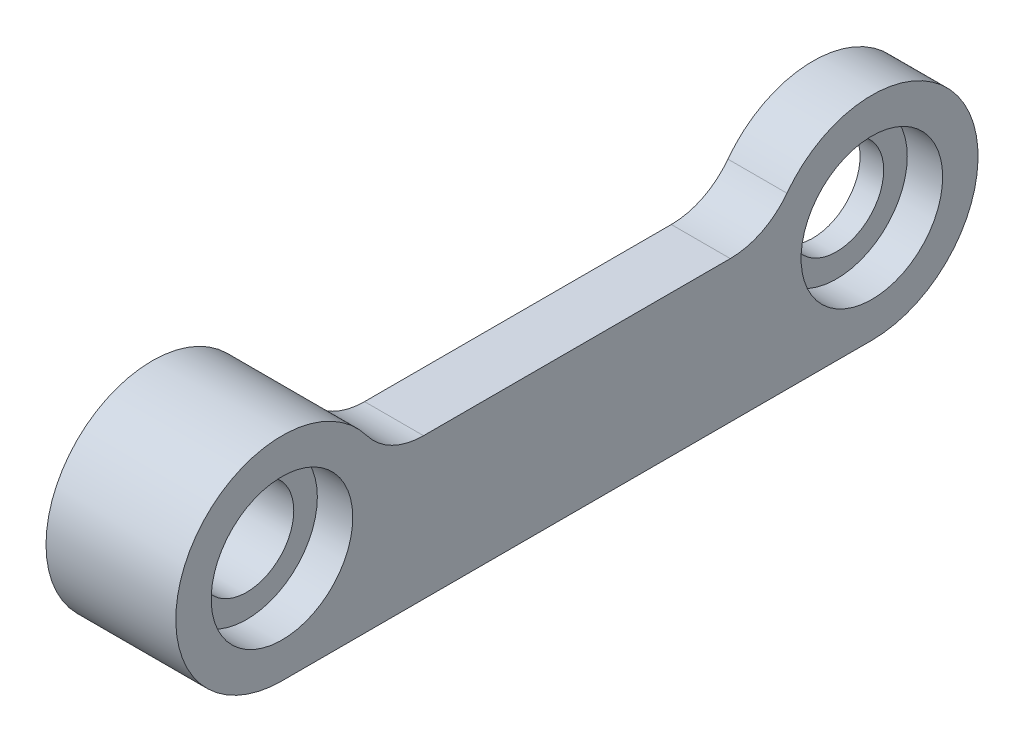
ISO-10303-21;
HEADER;
FILE_DESCRIPTION(('STEP AP214'),'2;1');
FILE_NAME('part.step','',(''),(''),'','','');
FILE_SCHEMA(('AUTOMOTIVE_DESIGN { 1 0 10303 214 1 1 1 1 }'));
ENDSEC;
DATA;
#1=APPLICATION_CONTEXT('core data for automotive mechanical design processes');
#2=APPLICATION_PROTOCOL_DEFINITION('international standard','automotive_design',2000,#1);
#3=PRODUCT_CONTEXT('',#1,'mechanical');
#4=PRODUCT('Part','Part','',(#3));
#5=PRODUCT_RELATED_PRODUCT_CATEGORY('part','',(#4));
#6=PRODUCT_DEFINITION_FORMATION('','',#4);
#7=PRODUCT_DEFINITION_CONTEXT('part definition',#1,'design');
#8=PRODUCT_DEFINITION('design','',#6,#7);
#9=PRODUCT_DEFINITION_SHAPE('','',#8);
#10=(LENGTH_UNIT() NAMED_UNIT(*) SI_UNIT(.MILLI.,.METRE.));
#11=(NAMED_UNIT(*) PLANE_ANGLE_UNIT() SI_UNIT($,.RADIAN.));
#12=(NAMED_UNIT(*) SI_UNIT($,.STERADIAN.) SOLID_ANGLE_UNIT());
#13=UNCERTAINTY_MEASURE_WITH_UNIT(LENGTH_MEASURE(1.E-05),#10,'distance_accuracy_value','');
#14=(GEOMETRIC_REPRESENTATION_CONTEXT(3) GLOBAL_UNCERTAINTY_ASSIGNED_CONTEXT((#13)) GLOBAL_UNIT_ASSIGNED_CONTEXT((#10,
#11,#12)) REPRESENTATION_CONTEXT('',''));
#15=CARTESIAN_POINT('',(0.,0.,0.));
#16=DIRECTION('',(0.,0.,1.));
#17=DIRECTION('',(1.,0.,0.));
#18=AXIS2_PLACEMENT_3D('',#15,#16,#17);
#19=CARTESIAN_POINT('',(2.5,-1.5,0.));
#20=DIRECTION('',(-1.,0.,0.));
#21=DIRECTION('',(0.,0.,1.));
#22=AXIS2_PLACEMENT_3D('',#19,#20,#21);
#23=CYLINDRICAL_SURFACE('',#22,2.);
#24=CARTESIAN_POINT('',(-3.,-1.5,0.));
#25=DIRECTION('',(1.,0.,0.));
#26=DIRECTION('',(0.,0.,-1.));
#27=AXIS2_PLACEMENT_3D('',#24,#25,#26);
#28=CIRCLE('',#27,2.);
#29=CARTESIAN_POINT('',(-3.,-1.5,-2.));
#30=VERTEX_POINT('',#29);
#31=EDGE_CURVE('E171',#30,#30,#28,.T.);
#32=ORIENTED_EDGE('',*,*,#31,.F.);
#33=EDGE_LOOP('',(#32));
#34=FACE_BOUND('',#33,.T.);
#35=CARTESIAN_POINT('',(1.,-1.5,0.));
#36=DIRECTION('',(1.,0.,0.));
#37=DIRECTION('',(0.,0.,-1.));
#38=AXIS2_PLACEMENT_3D('',#35,#36,#37);
#39=CIRCLE('',#38,2.);
#40=CARTESIAN_POINT('',(1.,-1.5,-2.));
#41=VERTEX_POINT('',#40);
#42=EDGE_CURVE('E73',#41,#41,#39,.T.);
#43=ORIENTED_EDGE('',*,*,#42,.T.);
#44=EDGE_LOOP('',(#43));
#45=FACE_BOUND('',#44,.T.);
#46=ADVANCED_FACE('F69',(#34,#45),#23,.F.);
#47=CARTESIAN_POINT('',(2.5,-1.5,-25.));
#48=DIRECTION('',(-1.,0.,0.));
#49=DIRECTION('',(0.,0.,1.));
#50=AXIS2_PLACEMENT_3D('',#47,#48,#49);
#51=CYLINDRICAL_SURFACE('',#50,2.);
#52=CARTESIAN_POINT('',(0.,-1.5,-25.));
#53=DIRECTION('',(1.,0.,0.));
#54=DIRECTION('',(0.,0.,-1.));
#55=AXIS2_PLACEMENT_3D('',#52,#53,#54);
#56=CIRCLE('',#55,2.);
#57=CARTESIAN_POINT('',(0.,-1.5,-27.));
#58=VERTEX_POINT('',#57);
#59=EDGE_CURVE('E167',#58,#58,#56,.F.);
#60=ORIENTED_EDGE('',*,*,#59,.T.);
#61=EDGE_LOOP('',(#60));
#62=FACE_BOUND('',#61,.T.);
#63=CARTESIAN_POINT('',(1.,-1.5,-25.));
#64=DIRECTION('',(1.,0.,0.));
#65=DIRECTION('',(0.,0.,-1.));
#66=AXIS2_PLACEMENT_3D('',#63,#64,#65);
#67=CIRCLE('',#66,2.);
#68=CARTESIAN_POINT('',(1.,-1.5,-27.));
#69=VERTEX_POINT('',#68);
#70=EDGE_CURVE('E190',#69,#69,#67,.T.);
#71=ORIENTED_EDGE('',*,*,#70,.T.);
#72=EDGE_LOOP('',(#71));
#73=FACE_BOUND('',#72,.T.);
#74=ADVANCED_FACE('F240',(#62,#73),#51,.F.);
#75=CARTESIAN_POINT('',(2.5,-1.5,0.));
#76=DIRECTION('',(1.,0.,0.));
#77=DIRECTION('',(0.,0.,-1.));
#78=AXIS2_PLACEMENT_3D('',#75,#76,#77);
#79=PLANE('',#78);
#80=CARTESIAN_POINT('',(2.5,-1.5,0.));
#81=DIRECTION('',(1.,0.,0.));
#82=DIRECTION('',(0.,0.,-1.));
#83=AXIS2_PLACEMENT_3D('',#80,#81,#82);
#84=CIRCLE('',#83,3.);
#85=CARTESIAN_POINT('',(2.5,-1.5,-3.));
#86=VERTEX_POINT('',#85);
#87=EDGE_CURVE('E200',#86,#86,#84,.T.);
#88=ORIENTED_EDGE('',*,*,#87,.F.);
#89=EDGE_LOOP('',(#88));
#90=FACE_BOUND('',#89,.T.);
#91=CARTESIAN_POINT('',(2.5,-1.5,-25.));
#92=DIRECTION('',(1.,0.,0.));
#93=DIRECTION('',(0.,0.,-1.));
#94=AXIS2_PLACEMENT_3D('',#91,#92,#93);
#95=CIRCLE('',#94,3.);
#96=CARTESIAN_POINT('',(2.5,-1.5,-28.));
#97=VERTEX_POINT('',#96);
#98=EDGE_CURVE('E212',#97,#97,#95,.T.);
#99=ORIENTED_EDGE('',*,*,#98,.F.);
#100=EDGE_LOOP('',(#99));
#101=FACE_BOUND('',#100,.T.);
#102=DIRECTION('',(0.,0.,-1.));
#103=VECTOR('',#102,1.);
#104=CARTESIAN_POINT('',(2.5,-6.,0.));
#105=LINE('',#104,#103);
#106=CARTESIAN_POINT('',(2.5,-6.,0.));
#107=VERTEX_POINT('',#106);
#108=CARTESIAN_POINT('',(2.5,-6.,-25.));
#109=VERTEX_POINT('',#108);
#110=EDGE_CURVE('E139',#107,#109,#105,.T.);
#111=ORIENTED_EDGE('',*,*,#110,.T.);
#112=CARTESIAN_POINT('',(2.5,-1.5,-25.));
#113=DIRECTION('',(1.,0.,0.));
#114=DIRECTION('',(0.,0.,-1.));
#115=AXIS2_PLACEMENT_3D('',#112,#113,#114);
#116=CIRCLE('',#115,4.5);
#117=CARTESIAN_POINT('',(2.5,1.2,-21.4));
#118=VERTEX_POINT('',#117);
#119=EDGE_CURVE('E149',#109,#118,#116,.T.);
#120=ORIENTED_EDGE('',*,*,#119,.T.);
#121=CARTESIAN_POINT('',(2.5,3.,-19.));
#122=DIRECTION('',(1.,0.,0.));
#123=DIRECTION('',(0.,0.,-1.));
#124=AXIS2_PLACEMENT_3D('',#121,#122,#123);
#125=CIRCLE('',#124,3.);
#126=CARTESIAN_POINT('',(2.5,0.,-19.));
#127=VERTEX_POINT('',#126);
#128=EDGE_CURVE('E186',#118,#127,#125,.F.);
#129=ORIENTED_EDGE('',*,*,#128,.T.);
#130=DIRECTION('',(0.,0.,-1.));
#131=VECTOR('',#130,1.);
#132=CARTESIAN_POINT('',(2.5,0.,0.));
#133=LINE('',#132,#131);
#134=CARTESIAN_POINT('',(2.5,0.,-6.));
#135=VERTEX_POINT('',#134);
#136=EDGE_CURVE('E158',#135,#127,#133,.T.);
#137=ORIENTED_EDGE('',*,*,#136,.F.);
#138=CARTESIAN_POINT('',(2.5,3.,-6.));
#139=DIRECTION('',(1.,0.,0.));
#140=DIRECTION('',(0.,0.,-1.));
#141=AXIS2_PLACEMENT_3D('',#138,#139,#140);
#142=CIRCLE('',#141,3.);
#143=CARTESIAN_POINT('',(2.5,1.2,-3.6));
#144=VERTEX_POINT('',#143);
#145=EDGE_CURVE('E12',#135,#144,#142,.F.);
#146=ORIENTED_EDGE('',*,*,#145,.T.);
#147=CARTESIAN_POINT('',(2.5,-1.5,0.));
#148=DIRECTION('',(1.,0.,0.));
#149=DIRECTION('',(0.,0.,-1.));
#150=AXIS2_PLACEMENT_3D('',#147,#148,#149);
#151=CIRCLE('',#150,4.5);
#152=EDGE_CURVE('E141',#144,#107,#151,.T.);
#153=ORIENTED_EDGE('',*,*,#152,.T.);
#154=EDGE_LOOP('',(#111,#120,#129,#137,#146,#153));
#155=FACE_BOUND('',#154,.T.);
#156=ADVANCED_FACE('F238',(#90,#101,#155),#79,.T.);
#157=CARTESIAN_POINT('',(2.5,-1.5,0.));
#158=DIRECTION('',(-1.,0.,0.));
#159=DIRECTION('',(0.,0.,1.));
#160=AXIS2_PLACEMENT_3D('',#157,#158,#159);
#161=CYLINDRICAL_SURFACE('',#160,4.5);
#162=ORIENTED_EDGE('',*,*,#152,.F.);
#163=DIRECTION('',(-1.,0.,0.));
#164=VECTOR('',#163,1.);
#165=CARTESIAN_POINT('',(2.5,1.2,-3.6));
#166=LINE('',#165,#164);
#167=CARTESIAN_POINT('',(0.,1.2,-3.6));
#168=VERTEX_POINT('',#167);
#169=EDGE_CURVE('E130',#144,#168,#166,.T.);
#170=ORIENTED_EDGE('',*,*,#169,.T.);
#171=CARTESIAN_POINT('',(0.,-1.5,0.));
#172=DIRECTION('',(1.,0.,0.));
#173=DIRECTION('',(0.,0.,-1.));
#174=AXIS2_PLACEMENT_3D('',#171,#172,#173);
#175=CIRCLE('',#174,4.5);
#176=CARTESIAN_POINT('',(0.,-6.,0.));
#177=VERTEX_POINT('',#176);
#178=EDGE_CURVE('E87',#177,#168,#175,.T.);
#179=ORIENTED_EDGE('',*,*,#178,.F.);
#180=DIRECTION('',(-1.,0.,0.));
#181=VECTOR('',#180,1.);
#182=CARTESIAN_POINT('',(2.5,-6.,0.));
#183=LINE('',#182,#181);
#184=EDGE_CURVE('E127',#107,#177,#183,.T.);
#185=ORIENTED_EDGE('',*,*,#184,.F.);
#186=EDGE_LOOP('',(#162,#170,#179,#185));
#187=FACE_BOUND('',#186,.T.);
#188=CARTESIAN_POINT('',(-3.,-1.5,0.));
#189=DIRECTION('',(1.,0.,0.));
#190=DIRECTION('',(0.,0.,-1.));
#191=AXIS2_PLACEMENT_3D('',#188,#189,#190);
#192=CIRCLE('',#191,4.5);
#193=CARTESIAN_POINT('',(-3.,-1.5,-4.5));
#194=VERTEX_POINT('',#193);
#195=EDGE_CURVE('E166',#194,#194,#192,.T.);
#196=ORIENTED_EDGE('',*,*,#195,.T.);
#197=EDGE_LOOP('',(#196));
#198=FACE_BOUND('',#197,.T.);
#199=ADVANCED_FACE('F125',(#187,#198),#161,.T.);
#200=CARTESIAN_POINT('',(0.,-1.5,0.));
#201=DIRECTION('',(1.,0.,0.));
#202=DIRECTION('',(0.,0.,-1.));
#203=AXIS2_PLACEMENT_3D('',#200,#201,#202);
#204=PLANE('',#203);
#205=ORIENTED_EDGE('',*,*,#59,.F.);
#206=EDGE_LOOP('',(#205));
#207=FACE_BOUND('',#206,.T.);
#208=DIRECTION('',(0.,0.,-1.));
#209=VECTOR('',#208,1.);
#210=CARTESIAN_POINT('',(0.,-6.,0.));
#211=LINE('',#210,#209);
#212=CARTESIAN_POINT('',(0.,-6.,-25.));
#213=VERTEX_POINT('',#212);
#214=EDGE_CURVE('E137',#177,#213,#211,.T.);
#215=ORIENTED_EDGE('',*,*,#214,.F.);
#216=ORIENTED_EDGE('',*,*,#178,.T.);
#217=CARTESIAN_POINT('',(0.,3.,-6.));
#218=DIRECTION('',(1.,0.,0.));
#219=DIRECTION('',(0.,0.,-1.));
#220=AXIS2_PLACEMENT_3D('',#217,#218,#219);
#221=CIRCLE('',#220,3.);
#222=CARTESIAN_POINT('',(0.,0.,-6.));
#223=VERTEX_POINT('',#222);
#224=EDGE_CURVE('E79',#168,#223,#221,.T.);
#225=ORIENTED_EDGE('',*,*,#224,.T.);
#226=DIRECTION('',(0.,0.,-1.));
#227=VECTOR('',#226,1.);
#228=CARTESIAN_POINT('',(0.,0.,0.));
#229=LINE('',#228,#227);
#230=CARTESIAN_POINT('',(0.,0.,-19.));
#231=VERTEX_POINT('',#230);
#232=EDGE_CURVE('E148',#223,#231,#229,.T.);
#233=ORIENTED_EDGE('',*,*,#232,.T.);
#234=CARTESIAN_POINT('',(0.,3.,-19.));
#235=DIRECTION('',(1.,0.,0.));
#236=DIRECTION('',(0.,0.,-1.));
#237=AXIS2_PLACEMENT_3D('',#234,#235,#236);
#238=CIRCLE('',#237,3.);
#239=CARTESIAN_POINT('',(0.,1.2,-21.4));
#240=VERTEX_POINT('',#239);
#241=EDGE_CURVE('E183',#231,#240,#238,.T.);
#242=ORIENTED_EDGE('',*,*,#241,.T.);
#243=CARTESIAN_POINT('',(0.,-1.5,-25.));
#244=DIRECTION('',(1.,0.,0.));
#245=DIRECTION('',(0.,0.,-1.));
#246=AXIS2_PLACEMENT_3D('',#243,#244,#245);
#247=CIRCLE('',#246,4.5);
#248=EDGE_CURVE('E146',#213,#240,#247,.T.);
#249=ORIENTED_EDGE('',*,*,#248,.F.);
#250=EDGE_LOOP('',(#215,#216,#225,#233,#242,#249));
#251=FACE_BOUND('',#250,.T.);
#252=ADVANCED_FACE('F144',(#207,#251),#204,.F.);
#253=CARTESIAN_POINT('',(2.5,-1.5,-25.));
#254=DIRECTION('',(-1.,0.,0.));
#255=DIRECTION('',(0.,0.,1.));
#256=AXIS2_PLACEMENT_3D('',#253,#254,#255);
#257=CYLINDRICAL_SURFACE('',#256,4.5);
#258=ORIENTED_EDGE('',*,*,#248,.T.);
#259=DIRECTION('',(-1.,0.,0.));
#260=VECTOR('',#259,1.);
#261=CARTESIAN_POINT('',(2.5,1.2,-21.4));
#262=LINE('',#261,#260);
#263=EDGE_CURVE('E178',#240,#118,#262,.F.);
#264=ORIENTED_EDGE('',*,*,#263,.T.);
#265=ORIENTED_EDGE('',*,*,#119,.F.);
#266=DIRECTION('',(-1.,0.,0.));
#267=VECTOR('',#266,1.);
#268=CARTESIAN_POINT('',(2.5,-6.,-25.));
#269=LINE('',#268,#267);
#270=EDGE_CURVE('E161',#109,#213,#269,.T.);
#271=ORIENTED_EDGE('',*,*,#270,.T.);
#272=EDGE_LOOP('',(#258,#264,#265,#271));
#273=FACE_BOUND('',#272,.T.);
#274=ADVANCED_FACE('F236',(#273),#257,.T.);
#275=CARTESIAN_POINT('',(2.5,0.,0.));
#276=DIRECTION('',(0.,1.,0.));
#277=DIRECTION('',(0.,0.,1.));
#278=AXIS2_PLACEMENT_3D('',#275,#276,#277);
#279=PLANE('',#278);
#280=ORIENTED_EDGE('',*,*,#136,.T.);
#281=DIRECTION('',(-1.,0.,0.));
#282=VECTOR('',#281,1.);
#283=CARTESIAN_POINT('',(2.5,0.,-19.));
#284=LINE('',#283,#282);
#285=EDGE_CURVE('E174',#127,#231,#284,.T.);
#286=ORIENTED_EDGE('',*,*,#285,.T.);
#287=ORIENTED_EDGE('',*,*,#232,.F.);
#288=DIRECTION('',(-1.,0.,0.));
#289=VECTOR('',#288,1.);
#290=CARTESIAN_POINT('',(2.5,0.,-6.));
#291=LINE('',#290,#289);
#292=EDGE_CURVE('E132',#223,#135,#291,.F.);
#293=ORIENTED_EDGE('',*,*,#292,.T.);
#294=EDGE_LOOP('',(#280,#286,#287,#293));
#295=FACE_BOUND('',#294,.T.);
#296=ADVANCED_FACE('F228',(#295),#279,.T.);
#297=CARTESIAN_POINT('',(2.5,-6.,0.));
#298=DIRECTION('',(0.,1.,0.));
#299=DIRECTION('',(0.,0.,1.));
#300=AXIS2_PLACEMENT_3D('',#297,#298,#299);
#301=PLANE('',#300);
#302=ORIENTED_EDGE('',*,*,#214,.T.);
#303=ORIENTED_EDGE('',*,*,#270,.F.);
#304=ORIENTED_EDGE('',*,*,#110,.F.);
#305=ORIENTED_EDGE('',*,*,#184,.T.);
#306=EDGE_LOOP('',(#302,#303,#304,#305));
#307=FACE_BOUND('',#306,.T.);
#308=ADVANCED_FACE('F136',(#307),#301,.F.);
#309=CARTESIAN_POINT('',(-3.,-1.5,0.));
#310=DIRECTION('',(1.,0.,0.));
#311=DIRECTION('',(0.,0.,-1.));
#312=AXIS2_PLACEMENT_3D('',#309,#310,#311);
#313=PLANE('',#312);
#314=ORIENTED_EDGE('',*,*,#31,.T.);
#315=EDGE_LOOP('',(#314));
#316=FACE_BOUND('',#315,.T.);
#317=ORIENTED_EDGE('',*,*,#195,.F.);
#318=EDGE_LOOP('',(#317));
#319=FACE_BOUND('',#318,.T.);
#320=ADVANCED_FACE('F243',(#316,#319),#313,.F.);
#321=CARTESIAN_POINT('',(2.5,3.,-19.));
#322=DIRECTION('',(-1.,0.,0.));
#323=DIRECTION('',(0.,0.,1.));
#324=AXIS2_PLACEMENT_3D('',#321,#322,#323);
#325=CYLINDRICAL_SURFACE('',#324,3.);
#326=ORIENTED_EDGE('',*,*,#128,.F.);
#327=ORIENTED_EDGE('',*,*,#263,.F.);
#328=ORIENTED_EDGE('',*,*,#241,.F.);
#329=ORIENTED_EDGE('',*,*,#285,.F.);
#330=EDGE_LOOP('',(#326,#327,#328,#329));
#331=FACE_BOUND('',#330,.T.);
#332=ADVANCED_FACE('F233',(#331),#325,.F.);
#333=CARTESIAN_POINT('',(2.5,3.,-6.));
#334=DIRECTION('',(-1.,0.,0.));
#335=DIRECTION('',(0.,0.,1.));
#336=AXIS2_PLACEMENT_3D('',#333,#334,#335);
#337=CYLINDRICAL_SURFACE('',#336,3.);
#338=ORIENTED_EDGE('',*,*,#145,.F.);
#339=ORIENTED_EDGE('',*,*,#292,.F.);
#340=ORIENTED_EDGE('',*,*,#224,.F.);
#341=ORIENTED_EDGE('',*,*,#169,.F.);
#342=EDGE_LOOP('',(#338,#339,#340,#341));
#343=FACE_BOUND('',#342,.T.);
#344=ADVANCED_FACE('F71',(#343),#337,.F.);
#345=CARTESIAN_POINT('',(1.,-1.5,-25.));
#346=DIRECTION('',(1.,0.,0.));
#347=DIRECTION('',(0.,0.,-1.));
#348=AXIS2_PLACEMENT_3D('',#345,#346,#347);
#349=CYLINDRICAL_SURFACE('',#348,3.);
#350=CARTESIAN_POINT('',(1.,-1.5,-25.));
#351=DIRECTION('',(1.,0.,0.));
#352=DIRECTION('',(0.,0.,-1.));
#353=AXIS2_PLACEMENT_3D('',#350,#351,#352);
#354=CIRCLE('',#353,3.);
#355=CARTESIAN_POINT('',(1.,-1.5,-28.));
#356=VERTEX_POINT('',#355);
#357=EDGE_CURVE('E206',#356,#356,#354,.T.);
#358=ORIENTED_EDGE('',*,*,#357,.F.);
#359=EDGE_LOOP('',(#358));
#360=FACE_BOUND('',#359,.T.);
#361=ORIENTED_EDGE('',*,*,#98,.T.);
#362=EDGE_LOOP('',(#361));
#363=FACE_BOUND('',#362,.T.);
#364=ADVANCED_FACE('F267',(#360,#363),#349,.F.);
#365=CARTESIAN_POINT('',(1.,-1.5,-25.));
#366=DIRECTION('',(1.,0.,0.));
#367=DIRECTION('',(0.,0.,-1.));
#368=AXIS2_PLACEMENT_3D('',#365,#366,#367);
#369=PLANE('',#368);
#370=ORIENTED_EDGE('',*,*,#70,.F.);
#371=EDGE_LOOP('',(#370));
#372=FACE_BOUND('',#371,.T.);
#373=ORIENTED_EDGE('',*,*,#357,.T.);
#374=EDGE_LOOP('',(#373));
#375=FACE_BOUND('',#374,.T.);
#376=ADVANCED_FACE('F270',(#372,#375),#369,.T.);
#377=CARTESIAN_POINT('',(1.,-1.5,0.));
#378=DIRECTION('',(1.,0.,0.));
#379=DIRECTION('',(0.,0.,-1.));
#380=AXIS2_PLACEMENT_3D('',#377,#378,#379);
#381=CYLINDRICAL_SURFACE('',#380,3.);
#382=CARTESIAN_POINT('',(1.,-1.5,0.));
#383=DIRECTION('',(1.,0.,0.));
#384=DIRECTION('',(0.,0.,-1.));
#385=AXIS2_PLACEMENT_3D('',#382,#383,#384);
#386=CIRCLE('',#385,3.);
#387=CARTESIAN_POINT('',(1.,-1.5,-3.));
#388=VERTEX_POINT('',#387);
#389=EDGE_CURVE('E193',#388,#388,#386,.T.);
#390=ORIENTED_EDGE('',*,*,#389,.F.);
#391=EDGE_LOOP('',(#390));
#392=FACE_BOUND('',#391,.T.);
#393=ORIENTED_EDGE('',*,*,#87,.T.);
#394=EDGE_LOOP('',(#393));
#395=FACE_BOUND('',#394,.T.);
#396=ADVANCED_FACE('F274',(#392,#395),#381,.F.);
#397=CARTESIAN_POINT('',(1.,-1.5,0.));
#398=DIRECTION('',(1.,0.,0.));
#399=DIRECTION('',(0.,0.,-1.));
#400=AXIS2_PLACEMENT_3D('',#397,#398,#399);
#401=PLANE('',#400);
#402=ORIENTED_EDGE('',*,*,#42,.F.);
#403=EDGE_LOOP('',(#402));
#404=FACE_BOUND('',#403,.T.);
#405=ORIENTED_EDGE('',*,*,#389,.T.);
#406=EDGE_LOOP('',(#405));
#407=FACE_BOUND('',#406,.T.);
#408=ADVANCED_FACE('F278',(#404,#407),#401,.T.);
#409=CLOSED_SHELL('',(#46,#74,#156,#199,#252,#274,#296,#308,#320,#332,#344,#364,#376,#396,#408));
#410=MANIFOLD_SOLID_BREP('B2',#409);
#411=ADVANCED_BREP_SHAPE_REPRESENTATION('',(#18,#410),#14);
#412=SHAPE_DEFINITION_REPRESENTATION(#9,#411);
ENDSEC;
END-ISO-10303-21;
